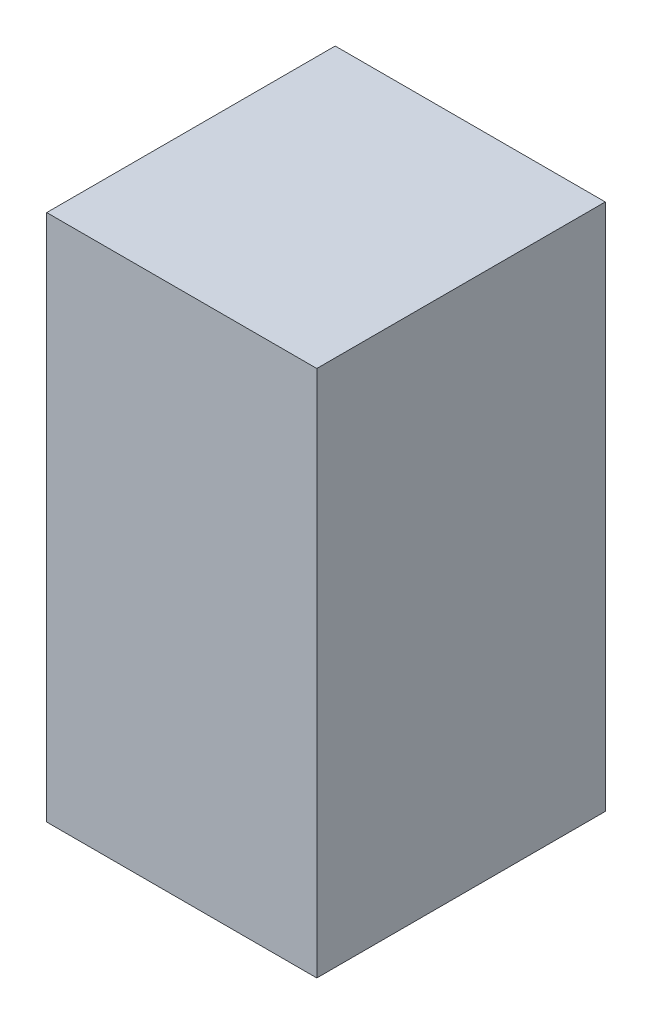
ISO-10303-21;
HEADER;
FILE_DESCRIPTION(('STEP AP214'),'2;1');
FILE_NAME('part.step','',(''),(''),'','','');
FILE_SCHEMA(('AUTOMOTIVE_DESIGN { 1 0 10303 214 1 1 1 1 }'));
ENDSEC;
DATA;
#1=APPLICATION_CONTEXT('core data for automotive mechanical design processes');
#2=APPLICATION_PROTOCOL_DEFINITION('international standard','automotive_design',2000,#1);
#3=PRODUCT_CONTEXT('',#1,'mechanical');
#4=PRODUCT('Part','Part','',(#3));
#5=PRODUCT_RELATED_PRODUCT_CATEGORY('part','',(#4));
#6=PRODUCT_DEFINITION_FORMATION('','',#4);
#7=PRODUCT_DEFINITION_CONTEXT('part definition',#1,'design');
#8=PRODUCT_DEFINITION('design','',#6,#7);
#9=PRODUCT_DEFINITION_SHAPE('','',#8);
#10=(LENGTH_UNIT() NAMED_UNIT(*) SI_UNIT(.MILLI.,.METRE.));
#11=(NAMED_UNIT(*) PLANE_ANGLE_UNIT() SI_UNIT($,.RADIAN.));
#12=(NAMED_UNIT(*) SI_UNIT($,.STERADIAN.) SOLID_ANGLE_UNIT());
#13=UNCERTAINTY_MEASURE_WITH_UNIT(LENGTH_MEASURE(1.E-05),#10,'distance_accuracy_value','');
#14=(GEOMETRIC_REPRESENTATION_CONTEXT(3) GLOBAL_UNCERTAINTY_ASSIGNED_CONTEXT((#13)) GLOBAL_UNIT_ASSIGNED_CONTEXT((#10,
#11,#12)) REPRESENTATION_CONTEXT('',''));
#15=CARTESIAN_POINT('',(0.,0.,0.));
#16=DIRECTION('',(0.,0.,1.));
#17=DIRECTION('',(1.,0.,0.));
#18=AXIS2_PLACEMENT_3D('',#15,#16,#17);
#19=CARTESIAN_POINT('',(2.20000068,4.29999902,0.));
#20=DIRECTION('',(1.,0.,0.));
#21=DIRECTION('',(0.,0.,-1.));
#22=AXIS2_PLACEMENT_3D('',#19,#20,#21);
#23=PLANE('',#22);
#24=DIRECTION('',(0.,0.,-1.));
#25=VECTOR('',#24,1.);
#26=CARTESIAN_POINT('',(2.20000068,-4.29999902,0.));
#27=LINE('',#26,#25);
#28=CARTESIAN_POINT('',(2.20000068,-4.29999902,0.));
#29=VERTEX_POINT('',#28);
#30=CARTESIAN_POINT('',(2.20000068,-4.29999902,4.70000076));
#31=VERTEX_POINT('',#30);
#32=EDGE_CURVE('E19',#29,#31,#27,.F.);
#33=ORIENTED_EDGE('',*,*,#32,.F.);
#34=DIRECTION('',(0.,1.,0.));
#35=VECTOR('',#34,1.);
#36=CARTESIAN_POINT('',(2.20000068,-4.29999902,0.));
#37=LINE('',#36,#35);
#38=CARTESIAN_POINT('',(2.20000068,4.29999902,0.));
#39=VERTEX_POINT('',#38);
#40=EDGE_CURVE('E78',#29,#39,#37,.T.);
#41=ORIENTED_EDGE('',*,*,#40,.T.);
#42=DIRECTION('',(0.,0.,1.));
#43=VECTOR('',#42,1.);
#44=CARTESIAN_POINT('',(2.20000068,4.29999902,0.));
#45=LINE('',#44,#43);
#46=CARTESIAN_POINT('',(2.20000068,4.29999902,4.70000076));
#47=VERTEX_POINT('',#46);
#48=EDGE_CURVE('E60',#47,#39,#45,.F.);
#49=ORIENTED_EDGE('',*,*,#48,.F.);
#50=DIRECTION('',(0.,1.,0.));
#51=VECTOR('',#50,1.);
#52=CARTESIAN_POINT('',(2.20000068,-4.29999902,4.70000076));
#53=LINE('',#52,#51);
#54=EDGE_CURVE('E55',#31,#47,#53,.T.);
#55=ORIENTED_EDGE('',*,*,#54,.F.);
#56=EDGE_LOOP('',(#33,#41,#49,#55));
#57=FACE_BOUND('',#56,.T.);
#58=ADVANCED_FACE('F16',(#57),#23,.T.);
#59=CARTESIAN_POINT('',(2.20000068,-4.29999902,0.));
#60=DIRECTION('',(0.,-1.,0.));
#61=DIRECTION('',(0.,0.,-1.));
#62=AXIS2_PLACEMENT_3D('',#59,#60,#61);
#63=PLANE('',#62);
#64=DIRECTION('',(0.,0.,1.));
#65=VECTOR('',#64,1.);
#66=CARTESIAN_POINT('',(-2.20000068,-4.29999902,0.));
#67=LINE('',#66,#65);
#68=CARTESIAN_POINT('',(-2.20000068,-4.29999902,0.));
#69=VERTEX_POINT('',#68);
#70=CARTESIAN_POINT('',(-2.20000068,-4.29999902,4.70000076));
#71=VERTEX_POINT('',#70);
#72=EDGE_CURVE('E82',#69,#71,#67,.T.);
#73=ORIENTED_EDGE('',*,*,#72,.F.);
#74=DIRECTION('',(1.,0.,0.));
#75=VECTOR('',#74,1.);
#76=CARTESIAN_POINT('',(2.20000068,-4.29999902,0.));
#77=LINE('',#76,#75);
#78=EDGE_CURVE('E67',#69,#29,#77,.T.);
#79=ORIENTED_EDGE('',*,*,#78,.T.);
#80=ORIENTED_EDGE('',*,*,#32,.T.);
#81=DIRECTION('',(1.,0.,0.));
#82=VECTOR('',#81,1.);
#83=CARTESIAN_POINT('',(2.20000068,-4.29999902,4.70000076));
#84=LINE('',#83,#82);
#85=EDGE_CURVE('E62',#71,#31,#84,.T.);
#86=ORIENTED_EDGE('',*,*,#85,.F.);
#87=EDGE_LOOP('',(#73,#79,#80,#86));
#88=FACE_BOUND('',#87,.T.);
#89=ADVANCED_FACE('F64',(#88),#63,.T.);
#90=CARTESIAN_POINT('',(2.20000068,-4.29999902,4.70000076));
#91=DIRECTION('',(0.,0.,1.));
#92=DIRECTION('',(1.,0.,0.));
#93=AXIS2_PLACEMENT_3D('',#90,#91,#92);
#94=PLANE('',#93);
#95=DIRECTION('',(0.,1.,0.));
#96=VECTOR('',#95,1.);
#97=CARTESIAN_POINT('',(-2.20000068,-4.29999902,4.70000076));
#98=LINE('',#97,#96);
#99=CARTESIAN_POINT('',(-2.20000068,4.29999902,4.70000076));
#100=VERTEX_POINT('',#99);
#101=EDGE_CURVE('E71',#71,#100,#98,.T.);
#102=ORIENTED_EDGE('',*,*,#101,.F.);
#103=ORIENTED_EDGE('',*,*,#85,.T.);
#104=ORIENTED_EDGE('',*,*,#54,.T.);
#105=DIRECTION('',(1.,0.,0.));
#106=VECTOR('',#105,1.);
#107=CARTESIAN_POINT('',(-2.20000068,4.29999902,4.70000076));
#108=LINE('',#107,#106);
#109=EDGE_CURVE('E73',#100,#47,#108,.T.);
#110=ORIENTED_EDGE('',*,*,#109,.F.);
#111=EDGE_LOOP('',(#102,#103,#104,#110));
#112=FACE_BOUND('',#111,.T.);
#113=ADVANCED_FACE('F69',(#112),#94,.T.);
#114=CARTESIAN_POINT('',(-2.20000068,4.29999902,0.));
#115=DIRECTION('',(0.,1.,0.));
#116=DIRECTION('',(0.,0.,1.));
#117=AXIS2_PLACEMENT_3D('',#114,#115,#116);
#118=PLANE('',#117);
#119=ORIENTED_EDGE('',*,*,#48,.T.);
#120=DIRECTION('',(1.,0.,0.));
#121=VECTOR('',#120,1.);
#122=CARTESIAN_POINT('',(2.20000068,4.29999902,0.));
#123=LINE('',#122,#121);
#124=CARTESIAN_POINT('',(-2.20000068,4.29999902,0.));
#125=VERTEX_POINT('',#124);
#126=EDGE_CURVE('E34',#39,#125,#123,.F.);
#127=ORIENTED_EDGE('',*,*,#126,.T.);
#128=DIRECTION('',(0.,0.,1.));
#129=VECTOR('',#128,1.);
#130=CARTESIAN_POINT('',(-2.20000068,4.29999902,0.));
#131=LINE('',#130,#129);
#132=EDGE_CURVE('E25',#100,#125,#131,.F.);
#133=ORIENTED_EDGE('',*,*,#132,.F.);
#134=ORIENTED_EDGE('',*,*,#109,.T.);
#135=EDGE_LOOP('',(#119,#127,#133,#134));
#136=FACE_BOUND('',#135,.T.);
#137=ADVANCED_FACE('F88',(#136),#118,.T.);
#138=CARTESIAN_POINT('',(2.20000068,-4.29999902,0.));
#139=DIRECTION('',(0.,0.,1.));
#140=DIRECTION('',(1.,0.,0.));
#141=AXIS2_PLACEMENT_3D('',#138,#139,#140);
#142=PLANE('',#141);
#143=DIRECTION('',(0.,1.,0.));
#144=VECTOR('',#143,1.);
#145=CARTESIAN_POINT('',(-2.20000068,-4.29999902,0.));
#146=LINE('',#145,#144);
#147=EDGE_CURVE('E11',#125,#69,#146,.F.);
#148=ORIENTED_EDGE('',*,*,#147,.F.);
#149=ORIENTED_EDGE('',*,*,#126,.F.);
#150=ORIENTED_EDGE('',*,*,#40,.F.);
#151=ORIENTED_EDGE('',*,*,#78,.F.);
#152=EDGE_LOOP('',(#148,#149,#150,#151));
#153=FACE_BOUND('',#152,.T.);
#154=ADVANCED_FACE('F90',(#153),#142,.F.);
#155=CARTESIAN_POINT('',(-2.20000068,-4.29999902,0.));
#156=DIRECTION('',(-1.,0.,0.));
#157=DIRECTION('',(0.,0.,1.));
#158=AXIS2_PLACEMENT_3D('',#155,#156,#157);
#159=PLANE('',#158);
#160=ORIENTED_EDGE('',*,*,#132,.T.);
#161=ORIENTED_EDGE('',*,*,#147,.T.);
#162=ORIENTED_EDGE('',*,*,#72,.T.);
#163=ORIENTED_EDGE('',*,*,#101,.T.);
#164=EDGE_LOOP('',(#160,#161,#162,#163));
#165=FACE_BOUND('',#164,.T.);
#166=ADVANCED_FACE('F87',(#165),#159,.T.);
#167=CLOSED_SHELL('',(#58,#89,#113,#137,#154,#166));
#168=MANIFOLD_SOLID_BREP('B1',#167);
#169=ADVANCED_BREP_SHAPE_REPRESENTATION('',(#18,#168),#14);
#170=SHAPE_DEFINITION_REPRESENTATION(#9,#169);
ENDSEC;
END-ISO-10303-21;
